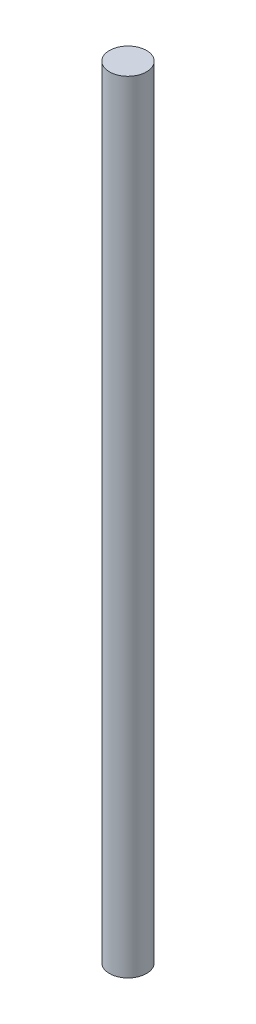
ISO-10303-21;
HEADER;
FILE_DESCRIPTION(('STEP AP214'),'2;1');
FILE_NAME('part.step','',(''),(''),'','','');
FILE_SCHEMA(('AUTOMOTIVE_DESIGN { 1 0 10303 214 1 1 1 1 }'));
ENDSEC;
DATA;
#1=APPLICATION_CONTEXT('core data for automotive mechanical design processes');
#2=APPLICATION_PROTOCOL_DEFINITION('international standard','automotive_design',2000,#1);
#3=PRODUCT_CONTEXT('',#1,'mechanical');
#4=PRODUCT('Part','Part','',(#3));
#5=PRODUCT_RELATED_PRODUCT_CATEGORY('part','',(#4));
#6=PRODUCT_DEFINITION_FORMATION('','',#4);
#7=PRODUCT_DEFINITION_CONTEXT('part definition',#1,'design');
#8=PRODUCT_DEFINITION('design','',#6,#7);
#9=PRODUCT_DEFINITION_SHAPE('','',#8);
#10=(LENGTH_UNIT() NAMED_UNIT(*) SI_UNIT(.MILLI.,.METRE.));
#11=(NAMED_UNIT(*) PLANE_ANGLE_UNIT() SI_UNIT($,.RADIAN.));
#12=(NAMED_UNIT(*) SI_UNIT($,.STERADIAN.) SOLID_ANGLE_UNIT());
#13=UNCERTAINTY_MEASURE_WITH_UNIT(LENGTH_MEASURE(1.E-05),#10,'distance_accuracy_value','');
#14=(GEOMETRIC_REPRESENTATION_CONTEXT(3) GLOBAL_UNCERTAINTY_ASSIGNED_CONTEXT((#13)) GLOBAL_UNIT_ASSIGNED_CONTEXT((#10,
#11,#12)) REPRESENTATION_CONTEXT('',''));
#15=CARTESIAN_POINT('',(0.,0.,0.));
#16=DIRECTION('',(0.,0.,1.));
#17=DIRECTION('',(1.,0.,0.));
#18=AXIS2_PLACEMENT_3D('',#15,#16,#17);
#19=CARTESIAN_POINT('',(0.,80.,0.));
#20=DIRECTION('',(0.,-1.,0.));
#21=DIRECTION('',(0.,0.,-1.));
#22=AXIS2_PLACEMENT_3D('',#19,#20,#21);
#23=CYLINDRICAL_SURFACE('',#22,1.9);
#24=CARTESIAN_POINT('',(0.,80.,0.));
#25=DIRECTION('',(0.,1.,0.));
#26=DIRECTION('',(0.,0.,1.));
#27=AXIS2_PLACEMENT_3D('',#24,#25,#26);
#28=CIRCLE('',#27,1.9);
#29=CARTESIAN_POINT('',(0.,80.,1.9));
#30=VERTEX_POINT('',#29);
#31=EDGE_CURVE('E10',#30,#30,#28,.T.);
#32=ORIENTED_EDGE('',*,*,#31,.F.);
#33=EDGE_LOOP('',(#32));
#34=FACE_BOUND('',#33,.T.);
#35=CARTESIAN_POINT('',(0.,0.,0.));
#36=DIRECTION('',(0.,1.,0.));
#37=DIRECTION('',(0.,0.,1.));
#38=AXIS2_PLACEMENT_3D('',#35,#36,#37);
#39=CIRCLE('',#38,1.9);
#40=CARTESIAN_POINT('',(0.,0.,1.9));
#41=VERTEX_POINT('',#40);
#42=EDGE_CURVE('E44',#41,#41,#39,.T.);
#43=ORIENTED_EDGE('',*,*,#42,.T.);
#44=EDGE_LOOP('',(#43));
#45=FACE_BOUND('',#44,.T.);
#46=ADVANCED_FACE('F41',(#34,#45),#23,.T.);
#47=CARTESIAN_POINT('',(0.,80.,0.));
#48=DIRECTION('',(0.,1.,0.));
#49=DIRECTION('',(0.,0.,1.));
#50=AXIS2_PLACEMENT_3D('',#47,#48,#49);
#51=PLANE('',#50);
#52=ORIENTED_EDGE('',*,*,#31,.T.);
#53=EDGE_LOOP('',(#52));
#54=FACE_BOUND('',#53,.T.);
#55=ADVANCED_FACE('F58',(#54),#51,.T.);
#56=CARTESIAN_POINT('',(0.,0.,0.));
#57=DIRECTION('',(0.,1.,0.));
#58=DIRECTION('',(0.,0.,1.));
#59=AXIS2_PLACEMENT_3D('',#56,#57,#58);
#60=PLANE('',#59);
#61=ORIENTED_EDGE('',*,*,#42,.F.);
#62=EDGE_LOOP('',(#61));
#63=FACE_BOUND('',#62,.T.);
#64=ADVANCED_FACE('F56',(#63),#60,.F.);
#65=CLOSED_SHELL('',(#46,#55,#64));
#66=MANIFOLD_SOLID_BREP('B2',#65);
#67=ADVANCED_BREP_SHAPE_REPRESENTATION('',(#18,#66),#14);
#68=SHAPE_DEFINITION_REPRESENTATION(#9,#67);
ENDSEC;
END-ISO-10303-21;
